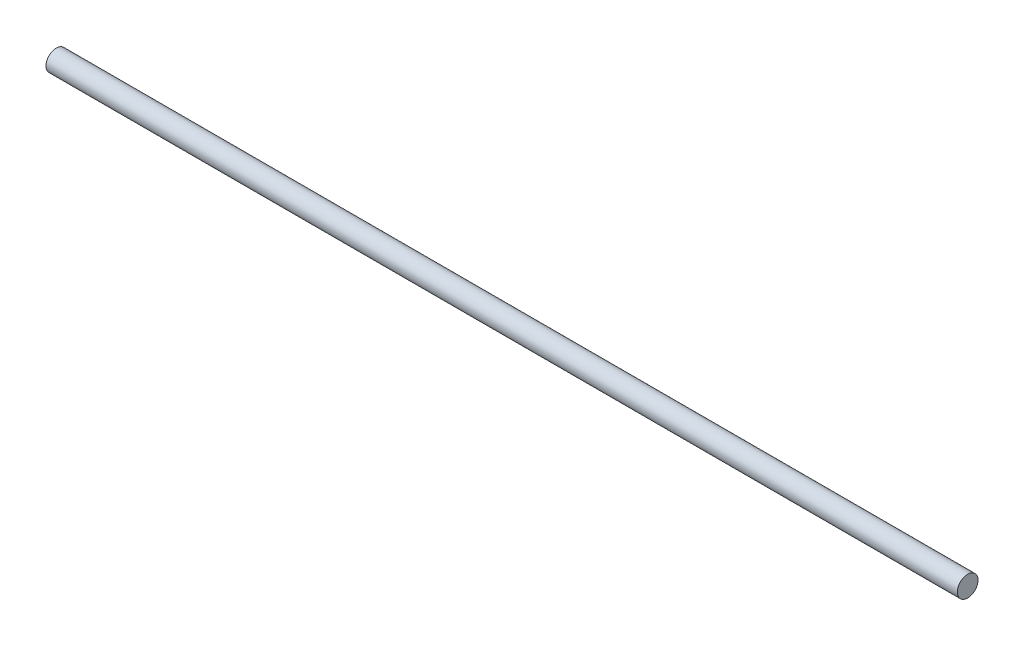
ISO-10303-21;
HEADER;
FILE_DESCRIPTION(('STEP AP214'),'2;1');
FILE_NAME('part.step','',(''),(''),'','','');
FILE_SCHEMA(('AUTOMOTIVE_DESIGN { 1 0 10303 214 1 1 1 1 }'));
ENDSEC;
DATA;
#1=APPLICATION_CONTEXT('core data for automotive mechanical design processes');
#2=APPLICATION_PROTOCOL_DEFINITION('international standard','automotive_design',2000,#1);
#3=PRODUCT_CONTEXT('',#1,'mechanical');
#4=PRODUCT('Part','Part','',(#3));
#5=PRODUCT_RELATED_PRODUCT_CATEGORY('part','',(#4));
#6=PRODUCT_DEFINITION_FORMATION('','',#4);
#7=PRODUCT_DEFINITION_CONTEXT('part definition',#1,'design');
#8=PRODUCT_DEFINITION('design','',#6,#7);
#9=PRODUCT_DEFINITION_SHAPE('','',#8);
#10=(LENGTH_UNIT() NAMED_UNIT(*) SI_UNIT(.MILLI.,.METRE.));
#11=(NAMED_UNIT(*) PLANE_ANGLE_UNIT() SI_UNIT($,.RADIAN.));
#12=(NAMED_UNIT(*) SI_UNIT($,.STERADIAN.) SOLID_ANGLE_UNIT());
#13=UNCERTAINTY_MEASURE_WITH_UNIT(LENGTH_MEASURE(1.E-05),#10,'distance_accuracy_value','');
#14=(GEOMETRIC_REPRESENTATION_CONTEXT(3) GLOBAL_UNCERTAINTY_ASSIGNED_CONTEXT((#13)) GLOBAL_UNIT_ASSIGNED_CONTEXT((#10,
#11,#12)) REPRESENTATION_CONTEXT('',''));
#15=CARTESIAN_POINT('',(0.,0.,0.));
#16=DIRECTION('',(0.,0.,1.));
#17=DIRECTION('',(1.,0.,0.));
#18=AXIS2_PLACEMENT_3D('',#15,#16,#17);
#19=CARTESIAN_POINT('',(140.,0.,0.));
#20=DIRECTION('',(-1.,0.,0.));
#21=DIRECTION('',(0.,0.,1.));
#22=AXIS2_PLACEMENT_3D('',#19,#20,#21);
#23=CYLINDRICAL_SURFACE('',#22,1.5875);
#24=CARTESIAN_POINT('',(140.,0.,0.));
#25=DIRECTION('',(1.,0.,0.));
#26=DIRECTION('',(0.,0.,-1.));
#27=AXIS2_PLACEMENT_3D('',#24,#25,#26);
#28=CIRCLE('',#27,1.5875);
#29=CARTESIAN_POINT('',(140.,0.,-1.5875));
#30=VERTEX_POINT('',#29);
#31=EDGE_CURVE('E10',#30,#30,#28,.T.);
#32=ORIENTED_EDGE('',*,*,#31,.F.);
#33=EDGE_LOOP('',(#32));
#34=FACE_BOUND('',#33,.T.);
#35=CARTESIAN_POINT('',(0.,0.,0.));
#36=DIRECTION('',(1.,0.,0.));
#37=DIRECTION('',(0.,0.,-1.));
#38=AXIS2_PLACEMENT_3D('',#35,#36,#37);
#39=CIRCLE('',#38,1.5875);
#40=CARTESIAN_POINT('',(0.,0.,-1.5875));
#41=VERTEX_POINT('',#40);
#42=EDGE_CURVE('E35',#41,#41,#39,.T.);
#43=ORIENTED_EDGE('',*,*,#42,.T.);
#44=EDGE_LOOP('',(#43));
#45=FACE_BOUND('',#44,.T.);
#46=ADVANCED_FACE('F32',(#34,#45),#23,.T.);
#47=CARTESIAN_POINT('',(140.,0.,0.));
#48=DIRECTION('',(1.,0.,0.));
#49=DIRECTION('',(0.,0.,-1.));
#50=AXIS2_PLACEMENT_3D('',#47,#48,#49);
#51=PLANE('',#50);
#52=ORIENTED_EDGE('',*,*,#31,.T.);
#53=EDGE_LOOP('',(#52));
#54=FACE_BOUND('',#53,.T.);
#55=ADVANCED_FACE('F47',(#54),#51,.T.);
#56=CARTESIAN_POINT('',(0.,0.,0.));
#57=DIRECTION('',(1.,0.,0.));
#58=DIRECTION('',(0.,0.,-1.));
#59=AXIS2_PLACEMENT_3D('',#56,#57,#58);
#60=PLANE('',#59);
#61=ORIENTED_EDGE('',*,*,#42,.F.);
#62=EDGE_LOOP('',(#61));
#63=FACE_BOUND('',#62,.T.);
#64=ADVANCED_FACE('F45',(#63),#60,.F.);
#65=CLOSED_SHELL('',(#46,#55,#64));
#66=MANIFOLD_SOLID_BREP('B2',#65);
#67=ADVANCED_BREP_SHAPE_REPRESENTATION('',(#18,#66),#14);
#68=SHAPE_DEFINITION_REPRESENTATION(#9,#67);
ENDSEC;
END-ISO-10303-21;
